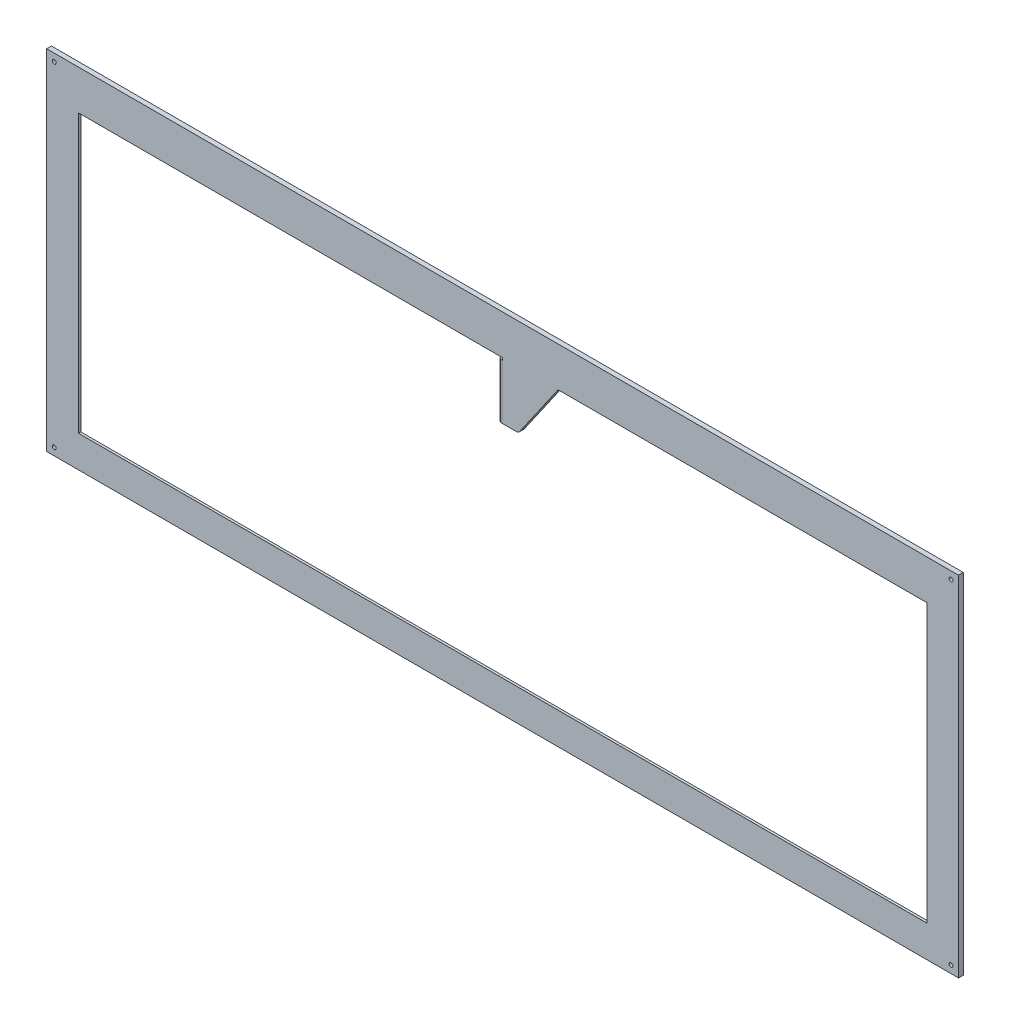
ISO-10303-21;
HEADER;
FILE_DESCRIPTION(('STEP AP214'),'2;1');
FILE_NAME('part.step','',(''),(''),'','','');
FILE_SCHEMA(('AUTOMOTIVE_DESIGN { 1 0 10303 214 1 1 1 1 }'));
ENDSEC;
DATA;
#1=APPLICATION_CONTEXT('core data for automotive mechanical design processes');
#2=APPLICATION_PROTOCOL_DEFINITION('international standard','automotive_design',2000,#1);
#3=PRODUCT_CONTEXT('',#1,'mechanical');
#4=PRODUCT('Part','Part','',(#3));
#5=PRODUCT_RELATED_PRODUCT_CATEGORY('part','',(#4));
#6=PRODUCT_DEFINITION_FORMATION('','',#4);
#7=PRODUCT_DEFINITION_CONTEXT('part definition',#1,'design');
#8=PRODUCT_DEFINITION('design','',#6,#7);
#9=PRODUCT_DEFINITION_SHAPE('','',#8);
#10=(LENGTH_UNIT() NAMED_UNIT(*) SI_UNIT(.MILLI.,.METRE.));
#11=(NAMED_UNIT(*) PLANE_ANGLE_UNIT() SI_UNIT($,.RADIAN.));
#12=(NAMED_UNIT(*) SI_UNIT($,.STERADIAN.) SOLID_ANGLE_UNIT());
#13=UNCERTAINTY_MEASURE_WITH_UNIT(LENGTH_MEASURE(1.E-05),#10,'distance_accuracy_value','');
#14=(GEOMETRIC_REPRESENTATION_CONTEXT(3) GLOBAL_UNCERTAINTY_ASSIGNED_CONTEXT((#13)) GLOBAL_UNIT_ASSIGNED_CONTEXT((#10,
#11,#12)) REPRESENTATION_CONTEXT('',''));
#15=CARTESIAN_POINT('',(0.,0.,0.));
#16=DIRECTION('',(0.,0.,1.));
#17=DIRECTION('',(1.,0.,0.));
#18=AXIS2_PLACEMENT_3D('',#15,#16,#17);
#19=CARTESIAN_POINT('',(-535.,175.,6.));
#20=DIRECTION('',(0.,-1.,0.));
#21=DIRECTION('',(0.,0.,-1.));
#22=AXIS2_PLACEMENT_3D('',#19,#20,#21);
#23=PLANE('',#22);
#24=DIRECTION('',(0.,0.,1.));
#25=VECTOR('',#24,1.);
#26=CARTESIAN_POINT('',(70.,175.,0.));
#27=LINE('',#26,#25);
#28=CARTESIAN_POINT('',(70.,175.,3.));
#29=VERTEX_POINT('',#28);
#30=CARTESIAN_POINT('',(70.,175.,6.));
#31=VERTEX_POINT('',#30);
#32=EDGE_CURVE('E298',#29,#31,#27,.T.);
#33=ORIENTED_EDGE('',*,*,#32,.F.);
#34=DIRECTION('',(1.,0.,0.));
#35=VECTOR('',#34,1.);
#36=CARTESIAN_POINT('',(535.,175.,3.));
#37=LINE('',#36,#35);
#38=CARTESIAN_POINT('',(535.,175.,3.));
#39=VERTEX_POINT('',#38);
#40=EDGE_CURVE('E310',#29,#39,#37,.T.);
#41=ORIENTED_EDGE('',*,*,#40,.T.);
#42=DIRECTION('',(0.,0.,-1.));
#43=VECTOR('',#42,1.);
#44=CARTESIAN_POINT('',(535.,175.,6.));
#45=LINE('',#44,#43);
#46=CARTESIAN_POINT('',(535.,175.,6.));
#47=VERTEX_POINT('',#46);
#48=EDGE_CURVE('E391',#47,#39,#45,.T.);
#49=ORIENTED_EDGE('',*,*,#48,.F.);
#50=DIRECTION('',(-1.,0.,0.));
#51=VECTOR('',#50,1.);
#52=CARTESIAN_POINT('',(-535.,175.,6.));
#53=LINE('',#52,#51);
#54=EDGE_CURVE('E374',#47,#31,#53,.T.);
#55=ORIENTED_EDGE('',*,*,#54,.T.);
#56=EDGE_LOOP('',(#33,#41,#49,#55));
#57=FACE_BOUND('',#56,.T.);
#58=ADVANCED_FACE('F33',(#57),#23,.T.);
#59=CARTESIAN_POINT('',(0.,0.,6.));
#60=DIRECTION('',(0.,0.,-1.));
#61=DIRECTION('',(-1.,0.,0.));
#62=AXIS2_PLACEMENT_3D('',#59,#60,#61);
#63=PLANE('',#62);
#64=CARTESIAN_POINT('',(565.5,-205.5,6.));
#65=DIRECTION('',(0.,0.,-1.));
#66=DIRECTION('',(-1.,0.,0.));
#67=AXIS2_PLACEMENT_3D('',#64,#65,#66);
#68=CIRCLE('',#67,2.49999999999991);
#69=CARTESIAN_POINT('',(563.,-205.5,6.));
#70=VERTEX_POINT('',#69);
#71=EDGE_CURVE('E348',#70,#70,#68,.T.);
#72=ORIENTED_EDGE('',*,*,#71,.T.);
#73=EDGE_LOOP('',(#72));
#74=FACE_BOUND('',#73,.T.);
#75=CARTESIAN_POINT('',(-565.5,-205.5,6.));
#76=DIRECTION('',(0.,0.,-1.));
#77=DIRECTION('',(-1.,0.,0.));
#78=AXIS2_PLACEMENT_3D('',#75,#76,#77);
#79=CIRCLE('',#78,2.49999999999991);
#80=CARTESIAN_POINT('',(-568.,-205.5,6.));
#81=VERTEX_POINT('',#80);
#82=EDGE_CURVE('E354',#81,#81,#79,.T.);
#83=ORIENTED_EDGE('',*,*,#82,.T.);
#84=EDGE_LOOP('',(#83));
#85=FACE_BOUND('',#84,.T.);
#86=CARTESIAN_POINT('',(-565.5,215.5,6.));
#87=DIRECTION('',(0.,0.,-1.));
#88=DIRECTION('',(-1.,0.,0.));
#89=AXIS2_PLACEMENT_3D('',#86,#87,#88);
#90=CIRCLE('',#89,2.49999999999991);
#91=CARTESIAN_POINT('',(-568.,215.5,6.));
#92=VERTEX_POINT('',#91);
#93=EDGE_CURVE('E360',#92,#92,#90,.T.);
#94=ORIENTED_EDGE('',*,*,#93,.T.);
#95=EDGE_LOOP('',(#94));
#96=FACE_BOUND('',#95,.T.);
#97=CARTESIAN_POINT('',(565.5,215.5,6.));
#98=DIRECTION('',(0.,0.,-1.));
#99=DIRECTION('',(-1.,0.,0.));
#100=AXIS2_PLACEMENT_3D('',#97,#98,#99);
#101=CIRCLE('',#100,2.49999999999991);
#102=CARTESIAN_POINT('',(563.,215.5,6.));
#103=VERTEX_POINT('',#102);
#104=EDGE_CURVE('E366',#103,#103,#101,.T.);
#105=ORIENTED_EDGE('',*,*,#104,.T.);
#106=EDGE_LOOP('',(#105));
#107=FACE_BOUND('',#106,.T.);
#108=DIRECTION('',(1.,0.,0.));
#109=VECTOR('',#108,1.);
#110=CARTESIAN_POINT('',(-575.,-215.,6.));
#111=LINE('',#110,#109);
#112=CARTESIAN_POINT('',(-575.,-215.,6.));
#113=VERTEX_POINT('',#112);
#114=CARTESIAN_POINT('',(575.,-215.,6.));
#115=VERTEX_POINT('',#114);
#116=EDGE_CURVE('E395',#113,#115,#111,.T.);
#117=ORIENTED_EDGE('',*,*,#116,.T.);
#118=DIRECTION('',(0.,1.,0.));
#119=VECTOR('',#118,1.);
#120=CARTESIAN_POINT('',(575.,225.,6.));
#121=LINE('',#120,#119);
#122=CARTESIAN_POINT('',(575.,225.,6.));
#123=VERTEX_POINT('',#122);
#124=EDGE_CURVE('E398',#115,#123,#121,.T.);
#125=ORIENTED_EDGE('',*,*,#124,.T.);
#126=DIRECTION('',(-1.,0.,0.));
#127=VECTOR('',#126,1.);
#128=CARTESIAN_POINT('',(-575.,225.,6.));
#129=LINE('',#128,#127);
#130=CARTESIAN_POINT('',(-575.,225.,6.));
#131=VERTEX_POINT('',#130);
#132=EDGE_CURVE('E401',#123,#131,#129,.T.);
#133=ORIENTED_EDGE('',*,*,#132,.T.);
#134=DIRECTION('',(0.,-1.,0.));
#135=VECTOR('',#134,1.);
#136=CARTESIAN_POINT('',(-575.,225.,6.));
#137=LINE('',#136,#135);
#138=EDGE_CURVE('E403',#131,#113,#137,.T.);
#139=ORIENTED_EDGE('',*,*,#138,.T.);
#140=EDGE_LOOP('',(#117,#125,#133,#139));
#141=FACE_BOUND('',#140,.T.);
#142=DIRECTION('',(1.,0.,0.));
#143=VECTOR('',#142,1.);
#144=CARTESIAN_POINT('',(0.,103.,6.));
#145=LINE('',#144,#143);
#146=CARTESIAN_POINT('',(-0.999999999999992,103.,6.));
#147=VERTEX_POINT('',#146);
#148=CARTESIAN_POINT('',(17.3848313886636,103.,6.));
#149=VERTEX_POINT('',#148);
#150=EDGE_CURVE('E290',#147,#149,#145,.T.);
#151=ORIENTED_EDGE('',*,*,#150,.T.);
#152=CARTESIAN_POINT('',(17.3848313886636,108.,6.));
#153=DIRECTION('',(0.,0.,-1.));
#154=DIRECTION('',(-1.,0.,0.));
#155=AXIS2_PLACEMENT_3D('',#152,#153,#154);
#156=CIRCLE('',#155,5.);
#157=CARTESIAN_POINT('',(21.4916812170301,105.148020952523,6.));
#158=VERTEX_POINT('',#157);
#159=EDGE_CURVE('E442',#149,#158,#156,.F.);
#160=ORIENTED_EDGE('',*,*,#159,.T.);
#161=DIRECTION('',(0.570395809495344,0.821369965673296,0.));
#162=VECTOR('',#161,1.);
#163=CARTESIAN_POINT('',(20.,103.,6.));
#164=LINE('',#163,#162);
#165=EDGE_CURVE('E278',#158,#31,#164,.T.);
#166=ORIENTED_EDGE('',*,*,#165,.T.);
#167=ORIENTED_EDGE('',*,*,#54,.F.);
#168=DIRECTION('',(0.,1.,0.));
#169=VECTOR('',#168,1.);
#170=CARTESIAN_POINT('',(535.,175.,6.));
#171=LINE('',#170,#169);
#172=CARTESIAN_POINT('',(535.,-175.,6.));
#173=VERTEX_POINT('',#172);
#174=EDGE_CURVE('E369',#173,#47,#171,.T.);
#175=ORIENTED_EDGE('',*,*,#174,.F.);
#176=DIRECTION('',(1.,0.,0.));
#177=VECTOR('',#176,1.);
#178=CARTESIAN_POINT('',(-535.,-175.,6.));
#179=LINE('',#178,#177);
#180=CARTESIAN_POINT('',(-535.,-175.,6.));
#181=VERTEX_POINT('',#180);
#182=EDGE_CURVE('E380',#181,#173,#179,.T.);
#183=ORIENTED_EDGE('',*,*,#182,.F.);
#184=DIRECTION('',(0.,-1.,0.));
#185=VECTOR('',#184,1.);
#186=CARTESIAN_POINT('',(-535.,175.,6.));
#187=LINE('',#186,#185);
#188=CARTESIAN_POINT('',(-535.,175.,6.));
#189=VERTEX_POINT('',#188);
#190=EDGE_CURVE('E377',#189,#181,#187,.T.);
#191=ORIENTED_EDGE('',*,*,#190,.F.);
#192=CARTESIAN_POINT('',(0.,175.,6.));
#193=VERTEX_POINT('',#192);
#194=EDGE_CURVE('E373',#193,#189,#53,.T.);
#195=ORIENTED_EDGE('',*,*,#194,.F.);
#196=DIRECTION('',(0.,-1.,0.));
#197=VECTOR('',#196,1.);
#198=CARTESIAN_POINT('',(1.11022302462516E-13,175.,6.));
#199=LINE('',#198,#197);
#200=CARTESIAN_POINT('',(1.06763767232988E-13,172.,6.));
#201=VERTEX_POINT('',#200);
#202=EDGE_CURVE('E265',#193,#201,#199,.T.);
#203=ORIENTED_EDGE('',*,*,#202,.T.);
#204=DIRECTION('',(-1.,0.,0.));
#205=VECTOR('',#204,1.);
#206=CARTESIAN_POINT('',(-5.99999999999999,172.,6.));
#207=LINE('',#206,#205);
#208=CARTESIAN_POINT('',(-0.999999999999992,172.,6.));
#209=VERTEX_POINT('',#208);
#210=EDGE_CURVE('E252',#201,#209,#207,.T.);
#211=ORIENTED_EDGE('',*,*,#210,.T.);
#212=DIRECTION('',(0.,-1.,0.));
#213=VECTOR('',#212,1.);
#214=CARTESIAN_POINT('',(-0.999999999999992,103.,6.));
#215=LINE('',#214,#213);
#216=EDGE_CURVE('E439',#209,#147,#215,.T.);
#217=ORIENTED_EDGE('',*,*,#216,.T.);
#218=EDGE_LOOP('',(#151,#160,#166,#167,#175,#183,#191,#195,#203,#211,#217));
#219=FACE_BOUND('',#218,.T.);
#220=ADVANCED_FACE('F490',(#74,#85,#96,#107,#141,#219),#63,.F.);
#221=CARTESIAN_POINT('',(0.,0.,0.));
#222=DIRECTION('',(0.,0.,-1.));
#223=DIRECTION('',(-1.,0.,0.));
#224=AXIS2_PLACEMENT_3D('',#221,#222,#223);
#225=PLANE('',#224);
#226=DIRECTION('',(-1.,0.,0.));
#227=VECTOR('',#226,1.);
#228=CARTESIAN_POINT('',(-556.,-196.,0.));
#229=LINE('',#228,#227);
#230=CARTESIAN_POINT('',(556.,-196.,0.));
#231=VERTEX_POINT('',#230);
#232=CARTESIAN_POINT('',(-556.,-196.,0.));
#233=VERTEX_POINT('',#232);
#234=EDGE_CURVE('E314',#231,#233,#229,.T.);
#235=ORIENTED_EDGE('',*,*,#234,.F.);
#236=DIRECTION('',(0.,-1.,0.));
#237=VECTOR('',#236,1.);
#238=CARTESIAN_POINT('',(556.,-196.,0.));
#239=LINE('',#238,#237);
#240=CARTESIAN_POINT('',(556.,206.,0.));
#241=VERTEX_POINT('',#240);
#242=EDGE_CURVE('E320',#241,#231,#239,.T.);
#243=ORIENTED_EDGE('',*,*,#242,.F.);
#244=DIRECTION('',(1.,0.,0.));
#245=VECTOR('',#244,1.);
#246=CARTESIAN_POINT('',(556.,206.,0.));
#247=LINE('',#246,#245);
#248=CARTESIAN_POINT('',(-556.,206.,0.));
#249=VERTEX_POINT('',#248);
#250=EDGE_CURVE('E334',#249,#241,#247,.T.);
#251=ORIENTED_EDGE('',*,*,#250,.F.);
#252=DIRECTION('',(0.,1.,0.));
#253=VECTOR('',#252,1.);
#254=CARTESIAN_POINT('',(-556.,206.,0.));
#255=LINE('',#254,#253);
#256=EDGE_CURVE('E331',#233,#249,#255,.T.);
#257=ORIENTED_EDGE('',*,*,#256,.F.);
#258=EDGE_LOOP('',(#235,#243,#251,#257));
#259=FACE_BOUND('',#258,.T.);
#260=CARTESIAN_POINT('',(565.5,-205.5,0.));
#261=DIRECTION('',(0.,0.,-1.));
#262=DIRECTION('',(-1.,0.,0.));
#263=AXIS2_PLACEMENT_3D('',#260,#261,#262);
#264=CIRCLE('',#263,2.49999999999991);
#265=CARTESIAN_POINT('',(563.,-205.5,0.));
#266=VERTEX_POINT('',#265);
#267=EDGE_CURVE('E341',#266,#266,#264,.T.);
#268=ORIENTED_EDGE('',*,*,#267,.F.);
#269=EDGE_LOOP('',(#268));
#270=FACE_BOUND('',#269,.T.);
#271=CARTESIAN_POINT('',(-565.5,-205.5,0.));
#272=DIRECTION('',(0.,0.,-1.));
#273=DIRECTION('',(-1.,0.,0.));
#274=AXIS2_PLACEMENT_3D('',#271,#272,#273);
#275=CIRCLE('',#274,2.49999999999991);
#276=CARTESIAN_POINT('',(-568.,-205.5,0.));
#277=VERTEX_POINT('',#276);
#278=EDGE_CURVE('E351',#277,#277,#275,.T.);
#279=ORIENTED_EDGE('',*,*,#278,.F.);
#280=EDGE_LOOP('',(#279));
#281=FACE_BOUND('',#280,.T.);
#282=CARTESIAN_POINT('',(-565.5,215.5,0.));
#283=DIRECTION('',(0.,0.,-1.));
#284=DIRECTION('',(-1.,0.,0.));
#285=AXIS2_PLACEMENT_3D('',#282,#283,#284);
#286=CIRCLE('',#285,2.49999999999991);
#287=CARTESIAN_POINT('',(-568.,215.5,0.));
#288=VERTEX_POINT('',#287);
#289=EDGE_CURVE('E357',#288,#288,#286,.T.);
#290=ORIENTED_EDGE('',*,*,#289,.F.);
#291=EDGE_LOOP('',(#290));
#292=FACE_BOUND('',#291,.T.);
#293=CARTESIAN_POINT('',(565.5,215.5,0.));
#294=DIRECTION('',(0.,0.,-1.));
#295=DIRECTION('',(-1.,0.,0.));
#296=AXIS2_PLACEMENT_3D('',#293,#294,#295);
#297=CIRCLE('',#296,2.49999999999991);
#298=CARTESIAN_POINT('',(563.,215.5,0.));
#299=VERTEX_POINT('',#298);
#300=EDGE_CURVE('E363',#299,#299,#297,.T.);
#301=ORIENTED_EDGE('',*,*,#300,.F.);
#302=EDGE_LOOP('',(#301));
#303=FACE_BOUND('',#302,.T.);
#304=DIRECTION('',(1.,0.,0.));
#305=VECTOR('',#304,1.);
#306=CARTESIAN_POINT('',(-575.,-215.,0.));
#307=LINE('',#306,#305);
#308=CARTESIAN_POINT('',(-575.,-215.,0.));
#309=VERTEX_POINT('',#308);
#310=CARTESIAN_POINT('',(575.,-215.,0.));
#311=VERTEX_POINT('',#310);
#312=EDGE_CURVE('E394',#309,#311,#307,.T.);
#313=ORIENTED_EDGE('',*,*,#312,.F.);
#314=DIRECTION('',(0.,-1.,0.));
#315=VECTOR('',#314,1.);
#316=CARTESIAN_POINT('',(-575.,225.,0.));
#317=LINE('',#316,#315);
#318=CARTESIAN_POINT('',(-575.,225.,0.));
#319=VERTEX_POINT('',#318);
#320=EDGE_CURVE('E399',#319,#309,#317,.T.);
#321=ORIENTED_EDGE('',*,*,#320,.F.);
#322=DIRECTION('',(-1.,0.,0.));
#323=VECTOR('',#322,1.);
#324=CARTESIAN_POINT('',(-575.,225.,0.));
#325=LINE('',#324,#323);
#326=CARTESIAN_POINT('',(575.,225.,0.));
#327=VERTEX_POINT('',#326);
#328=EDGE_CURVE('E410',#327,#319,#325,.T.);
#329=ORIENTED_EDGE('',*,*,#328,.F.);
#330=DIRECTION('',(0.,1.,0.));
#331=VECTOR('',#330,1.);
#332=CARTESIAN_POINT('',(575.,225.,0.));
#333=LINE('',#332,#331);
#334=EDGE_CURVE('E408',#311,#327,#333,.T.);
#335=ORIENTED_EDGE('',*,*,#334,.F.);
#336=EDGE_LOOP('',(#313,#321,#329,#335));
#337=FACE_BOUND('',#336,.T.);
#338=ADVANCED_FACE('F555',(#259,#270,#281,#292,#303,#337),#225,.T.);
#339=CARTESIAN_POINT('',(-575.,-215.,6.));
#340=DIRECTION('',(0.,1.,0.));
#341=DIRECTION('',(-1.,0.,0.));
#342=AXIS2_PLACEMENT_3D('',#339,#340,#341);
#343=PLANE('',#342);
#344=ORIENTED_EDGE('',*,*,#312,.T.);
#345=DIRECTION('',(0.,0.,-1.));
#346=VECTOR('',#345,1.);
#347=CARTESIAN_POINT('',(575.,-215.,6.));
#348=LINE('',#347,#346);
#349=EDGE_CURVE('E421',#115,#311,#348,.T.);
#350=ORIENTED_EDGE('',*,*,#349,.F.);
#351=ORIENTED_EDGE('',*,*,#116,.F.);
#352=DIRECTION('',(0.,0.,-1.));
#353=VECTOR('',#352,1.);
#354=CARTESIAN_POINT('',(-575.,-215.,6.));
#355=LINE('',#354,#353);
#356=EDGE_CURVE('E405',#113,#309,#355,.T.);
#357=ORIENTED_EDGE('',*,*,#356,.T.);
#358=EDGE_LOOP('',(#344,#350,#351,#357));
#359=FACE_BOUND('',#358,.T.);
#360=ADVANCED_FACE('F558',(#359),#343,.F.);
#361=CARTESIAN_POINT('',(575.,225.,6.));
#362=DIRECTION('',(-1.,0.,0.));
#363=DIRECTION('',(0.,0.,1.));
#364=AXIS2_PLACEMENT_3D('',#361,#362,#363);
#365=PLANE('',#364);
#366=ORIENTED_EDGE('',*,*,#334,.T.);
#367=DIRECTION('',(0.,0.,-1.));
#368=VECTOR('',#367,1.);
#369=CARTESIAN_POINT('',(575.,225.,6.));
#370=LINE('',#369,#368);
#371=EDGE_CURVE('E418',#123,#327,#370,.T.);
#372=ORIENTED_EDGE('',*,*,#371,.F.);
#373=ORIENTED_EDGE('',*,*,#124,.F.);
#374=ORIENTED_EDGE('',*,*,#349,.T.);
#375=EDGE_LOOP('',(#366,#372,#373,#374));
#376=FACE_BOUND('',#375,.T.);
#377=ADVANCED_FACE('F584',(#376),#365,.F.);
#378=CARTESIAN_POINT('',(-575.,225.,6.));
#379=DIRECTION('',(0.,-1.,0.));
#380=DIRECTION('',(0.,0.,-1.));
#381=AXIS2_PLACEMENT_3D('',#378,#379,#380);
#382=PLANE('',#381);
#383=ORIENTED_EDGE('',*,*,#328,.T.);
#384=DIRECTION('',(0.,0.,-1.));
#385=VECTOR('',#384,1.);
#386=CARTESIAN_POINT('',(-575.,225.,6.));
#387=LINE('',#386,#385);
#388=EDGE_CURVE('E415',#131,#319,#387,.T.);
#389=ORIENTED_EDGE('',*,*,#388,.F.);
#390=ORIENTED_EDGE('',*,*,#132,.F.);
#391=ORIENTED_EDGE('',*,*,#371,.T.);
#392=EDGE_LOOP('',(#383,#389,#390,#391));
#393=FACE_BOUND('',#392,.T.);
#394=ADVANCED_FACE('F581',(#393),#382,.F.);
#395=CARTESIAN_POINT('',(-575.,225.,6.));
#396=DIRECTION('',(1.,0.,0.));
#397=DIRECTION('',(0.,0.,-1.));
#398=AXIS2_PLACEMENT_3D('',#395,#396,#397);
#399=PLANE('',#398);
#400=ORIENTED_EDGE('',*,*,#320,.T.);
#401=ORIENTED_EDGE('',*,*,#356,.F.);
#402=ORIENTED_EDGE('',*,*,#138,.F.);
#403=ORIENTED_EDGE('',*,*,#388,.T.);
#404=EDGE_LOOP('',(#400,#401,#402,#403));
#405=FACE_BOUND('',#404,.T.);
#406=ADVANCED_FACE('F577',(#405),#399,.F.);
#407=CARTESIAN_POINT('',(535.,175.,6.));
#408=DIRECTION('',(-1.,0.,0.));
#409=DIRECTION('',(0.,0.,1.));
#410=AXIS2_PLACEMENT_3D('',#407,#408,#409);
#411=PLANE('',#410);
#412=DIRECTION('',(0.,-1.,0.));
#413=VECTOR('',#412,1.);
#414=CARTESIAN_POINT('',(535.,-175.,3.));
#415=LINE('',#414,#413);
#416=CARTESIAN_POINT('',(535.,-175.,3.));
#417=VERTEX_POINT('',#416);
#418=EDGE_CURVE('E297',#39,#417,#415,.T.);
#419=ORIENTED_EDGE('',*,*,#418,.T.);
#420=DIRECTION('',(0.,0.,-1.));
#421=VECTOR('',#420,1.);
#422=CARTESIAN_POINT('',(535.,-175.,6.));
#423=LINE('',#422,#421);
#424=EDGE_CURVE('E382',#173,#417,#423,.T.);
#425=ORIENTED_EDGE('',*,*,#424,.F.);
#426=ORIENTED_EDGE('',*,*,#174,.T.);
#427=ORIENTED_EDGE('',*,*,#48,.T.);
#428=EDGE_LOOP('',(#419,#425,#426,#427));
#429=FACE_BOUND('',#428,.T.);
#430=ADVANCED_FACE('F523',(#429),#411,.T.);
#431=DIRECTION('',(0.,0.,1.));
#432=VECTOR('',#431,1.);
#433=CARTESIAN_POINT('',(1.11022302462516E-13,175.,0.));
#434=LINE('',#433,#432);
#435=CARTESIAN_POINT('',(1.11022302462516E-13,175.,3.));
#436=VERTEX_POINT('',#435);
#437=EDGE_CURVE('E287',#436,#193,#434,.T.);
#438=ORIENTED_EDGE('',*,*,#437,.T.);
#439=ORIENTED_EDGE('',*,*,#194,.T.);
#440=DIRECTION('',(0.,0.,-1.));
#441=VECTOR('',#440,1.);
#442=CARTESIAN_POINT('',(-535.,175.,6.));
#443=LINE('',#442,#441);
#444=CARTESIAN_POINT('',(-535.,175.,3.));
#445=VERTEX_POINT('',#444);
#446=EDGE_CURVE('E388',#189,#445,#443,.T.);
#447=ORIENTED_EDGE('',*,*,#446,.T.);
#448=EDGE_CURVE('E311',#445,#436,#37,.T.);
#449=ORIENTED_EDGE('',*,*,#448,.T.);
#450=EDGE_LOOP('',(#438,#439,#447,#449));
#451=FACE_BOUND('',#450,.T.);
#452=ADVANCED_FACE('F532',(#451),#23,.T.);
#453=CARTESIAN_POINT('',(-535.,175.,6.));
#454=DIRECTION('',(1.,0.,0.));
#455=DIRECTION('',(0.,0.,-1.));
#456=AXIS2_PLACEMENT_3D('',#453,#454,#455);
#457=PLANE('',#456);
#458=DIRECTION('',(0.,1.,0.));
#459=VECTOR('',#458,1.);
#460=CARTESIAN_POINT('',(-535.,175.,3.));
#461=LINE('',#460,#459);
#462=CARTESIAN_POINT('',(-535.,-175.,3.));
#463=VERTEX_POINT('',#462);
#464=EDGE_CURVE('E307',#463,#445,#461,.T.);
#465=ORIENTED_EDGE('',*,*,#464,.T.);
#466=ORIENTED_EDGE('',*,*,#446,.F.);
#467=ORIENTED_EDGE('',*,*,#190,.T.);
#468=DIRECTION('',(0.,0.,-1.));
#469=VECTOR('',#468,1.);
#470=CARTESIAN_POINT('',(-535.,-175.,6.));
#471=LINE('',#470,#469);
#472=EDGE_CURVE('E385',#181,#463,#471,.T.);
#473=ORIENTED_EDGE('',*,*,#472,.T.);
#474=EDGE_LOOP('',(#465,#466,#467,#473));
#475=FACE_BOUND('',#474,.T.);
#476=ADVANCED_FACE('F530',(#475),#457,.T.);
#477=CARTESIAN_POINT('',(-535.,-175.,6.));
#478=DIRECTION('',(0.,1.,0.));
#479=DIRECTION('',(0.,0.,1.));
#480=AXIS2_PLACEMENT_3D('',#477,#478,#479);
#481=PLANE('',#480);
#482=DIRECTION('',(-1.,0.,0.));
#483=VECTOR('',#482,1.);
#484=CARTESIAN_POINT('',(-535.,-175.,3.));
#485=LINE('',#484,#483);
#486=EDGE_CURVE('E304',#417,#463,#485,.T.);
#487=ORIENTED_EDGE('',*,*,#486,.T.);
#488=ORIENTED_EDGE('',*,*,#472,.F.);
#489=ORIENTED_EDGE('',*,*,#182,.T.);
#490=ORIENTED_EDGE('',*,*,#424,.T.);
#491=EDGE_LOOP('',(#487,#488,#489,#490));
#492=FACE_BOUND('',#491,.T.);
#493=ADVANCED_FACE('F527',(#492),#481,.T.);
#494=CARTESIAN_POINT('',(565.5,215.5,6.));
#495=DIRECTION('',(0.,0.,-1.));
#496=DIRECTION('',(-1.,0.,0.));
#497=AXIS2_PLACEMENT_3D('',#494,#495,#496);
#498=CYLINDRICAL_SURFACE('',#497,2.49999999999991);
#499=ORIENTED_EDGE('',*,*,#104,.F.);
#500=EDGE_LOOP('',(#499));
#501=FACE_BOUND('',#500,.T.);
#502=ORIENTED_EDGE('',*,*,#300,.T.);
#503=EDGE_LOOP('',(#502));
#504=FACE_BOUND('',#503,.T.);
#505=ADVANCED_FACE('F811',(#501,#504),#498,.F.);
#506=CARTESIAN_POINT('',(-565.5,215.5,6.));
#507=DIRECTION('',(0.,0.,-1.));
#508=DIRECTION('',(-1.,0.,0.));
#509=AXIS2_PLACEMENT_3D('',#506,#507,#508);
#510=CYLINDRICAL_SURFACE('',#509,2.49999999999991);
#511=ORIENTED_EDGE('',*,*,#93,.F.);
#512=EDGE_LOOP('',(#511));
#513=FACE_BOUND('',#512,.T.);
#514=ORIENTED_EDGE('',*,*,#289,.T.);
#515=EDGE_LOOP('',(#514));
#516=FACE_BOUND('',#515,.T.);
#517=ADVANCED_FACE('F850',(#513,#516),#510,.F.);
#518=CARTESIAN_POINT('',(-565.5,-205.5,6.));
#519=DIRECTION('',(0.,0.,-1.));
#520=DIRECTION('',(-1.,0.,0.));
#521=AXIS2_PLACEMENT_3D('',#518,#519,#520);
#522=CYLINDRICAL_SURFACE('',#521,2.49999999999991);
#523=ORIENTED_EDGE('',*,*,#82,.F.);
#524=EDGE_LOOP('',(#523));
#525=FACE_BOUND('',#524,.T.);
#526=ORIENTED_EDGE('',*,*,#278,.T.);
#527=EDGE_LOOP('',(#526));
#528=FACE_BOUND('',#527,.T.);
#529=ADVANCED_FACE('F840',(#525,#528),#522,.F.);
#530=CARTESIAN_POINT('',(565.5,-205.5,6.));
#531=DIRECTION('',(0.,0.,-1.));
#532=DIRECTION('',(-1.,0.,0.));
#533=AXIS2_PLACEMENT_3D('',#530,#531,#532);
#534=CYLINDRICAL_SURFACE('',#533,2.49999999999991);
#535=ORIENTED_EDGE('',*,*,#71,.F.);
#536=EDGE_LOOP('',(#535));
#537=FACE_BOUND('',#536,.T.);
#538=ORIENTED_EDGE('',*,*,#267,.T.);
#539=EDGE_LOOP('',(#538));
#540=FACE_BOUND('',#539,.T.);
#541=ADVANCED_FACE('F800',(#537,#540),#534,.F.);
#542=CARTESIAN_POINT('',(-556.,-196.,3.));
#543=DIRECTION('',(0.,-1.,0.));
#544=DIRECTION('',(0.,0.,-1.));
#545=AXIS2_PLACEMENT_3D('',#542,#543,#544);
#546=PLANE('',#545);
#547=ORIENTED_EDGE('',*,*,#234,.T.);
#548=DIRECTION('',(0.,0.,-1.));
#549=VECTOR('',#548,1.);
#550=CARTESIAN_POINT('',(-556.,-196.,3.));
#551=LINE('',#550,#549);
#552=CARTESIAN_POINT('',(-556.,-196.,3.));
#553=VERTEX_POINT('',#552);
#554=EDGE_CURVE('E329',#553,#233,#551,.T.);
#555=ORIENTED_EDGE('',*,*,#554,.F.);
#556=DIRECTION('',(-1.,0.,0.));
#557=VECTOR('',#556,1.);
#558=CARTESIAN_POINT('',(-556.,-196.,3.));
#559=LINE('',#558,#557);
#560=CARTESIAN_POINT('',(556.,-196.,3.));
#561=VERTEX_POINT('',#560);
#562=EDGE_CURVE('E316',#561,#553,#559,.T.);
#563=ORIENTED_EDGE('',*,*,#562,.F.);
#564=DIRECTION('',(0.,0.,-1.));
#565=VECTOR('',#564,1.);
#566=CARTESIAN_POINT('',(556.,-196.,3.));
#567=LINE('',#566,#565);
#568=EDGE_CURVE('E339',#561,#231,#567,.T.);
#569=ORIENTED_EDGE('',*,*,#568,.T.);
#570=EDGE_LOOP('',(#547,#555,#563,#569));
#571=FACE_BOUND('',#570,.T.);
#572=ADVANCED_FACE('F543',(#571),#546,.F.);
#573=CARTESIAN_POINT('',(556.,-196.,3.));
#574=DIRECTION('',(1.,0.,0.));
#575=DIRECTION('',(0.,0.,-1.));
#576=AXIS2_PLACEMENT_3D('',#573,#574,#575);
#577=PLANE('',#576);
#578=ORIENTED_EDGE('',*,*,#242,.T.);
#579=ORIENTED_EDGE('',*,*,#568,.F.);
#580=DIRECTION('',(0.,-1.,0.));
#581=VECTOR('',#580,1.);
#582=CARTESIAN_POINT('',(556.,-196.,3.));
#583=LINE('',#582,#581);
#584=CARTESIAN_POINT('',(556.,206.,3.));
#585=VERTEX_POINT('',#584);
#586=EDGE_CURVE('E326',#585,#561,#583,.T.);
#587=ORIENTED_EDGE('',*,*,#586,.F.);
#588=DIRECTION('',(0.,0.,-1.));
#589=VECTOR('',#588,1.);
#590=CARTESIAN_POINT('',(556.,206.,3.));
#591=LINE('',#590,#589);
#592=EDGE_CURVE('E342',#585,#241,#591,.T.);
#593=ORIENTED_EDGE('',*,*,#592,.T.);
#594=EDGE_LOOP('',(#578,#579,#587,#593));
#595=FACE_BOUND('',#594,.T.);
#596=ADVANCED_FACE('F552',(#595),#577,.F.);
#597=CARTESIAN_POINT('',(556.,206.,3.));
#598=DIRECTION('',(0.,1.,0.));
#599=DIRECTION('',(0.,0.,1.));
#600=AXIS2_PLACEMENT_3D('',#597,#598,#599);
#601=PLANE('',#600);
#602=ORIENTED_EDGE('',*,*,#250,.T.);
#603=ORIENTED_EDGE('',*,*,#592,.F.);
#604=DIRECTION('',(1.,0.,0.));
#605=VECTOR('',#604,1.);
#606=CARTESIAN_POINT('',(556.,206.,3.));
#607=LINE('',#606,#605);
#608=CARTESIAN_POINT('',(-556.,206.,3.));
#609=VERTEX_POINT('',#608);
#610=EDGE_CURVE('E323',#609,#585,#607,.T.);
#611=ORIENTED_EDGE('',*,*,#610,.F.);
#612=DIRECTION('',(0.,0.,-1.));
#613=VECTOR('',#612,1.);
#614=CARTESIAN_POINT('',(-556.,206.,3.));
#615=LINE('',#614,#613);
#616=EDGE_CURVE('E344',#609,#249,#615,.T.);
#617=ORIENTED_EDGE('',*,*,#616,.T.);
#618=EDGE_LOOP('',(#602,#603,#611,#617));
#619=FACE_BOUND('',#618,.T.);
#620=ADVANCED_FACE('F550',(#619),#601,.F.);
#621=CARTESIAN_POINT('',(-556.,206.,3.));
#622=DIRECTION('',(-1.,0.,0.));
#623=DIRECTION('',(0.,-1.,0.));
#624=AXIS2_PLACEMENT_3D('',#621,#622,#623);
#625=PLANE('',#624);
#626=ORIENTED_EDGE('',*,*,#256,.T.);
#627=ORIENTED_EDGE('',*,*,#616,.F.);
#628=DIRECTION('',(0.,1.,0.));
#629=VECTOR('',#628,1.);
#630=CARTESIAN_POINT('',(-556.,206.,3.));
#631=LINE('',#630,#629);
#632=EDGE_CURVE('E319',#553,#609,#631,.T.);
#633=ORIENTED_EDGE('',*,*,#632,.F.);
#634=ORIENTED_EDGE('',*,*,#554,.T.);
#635=EDGE_LOOP('',(#626,#627,#633,#634));
#636=FACE_BOUND('',#635,.T.);
#637=ADVANCED_FACE('F537',(#636),#625,.F.);
#638=CARTESIAN_POINT('',(0.,0.,3.));
#639=DIRECTION('',(0.,0.,1.));
#640=DIRECTION('',(1.,0.,0.));
#641=AXIS2_PLACEMENT_3D('',#638,#639,#640);
#642=PLANE('',#641);
#643=ORIENTED_EDGE('',*,*,#418,.F.);
#644=ORIENTED_EDGE('',*,*,#40,.F.);
#645=EDGE_CURVE('E315',#436,#29,#37,.T.);
#646=ORIENTED_EDGE('',*,*,#645,.F.);
#647=ORIENTED_EDGE('',*,*,#448,.F.);
#648=ORIENTED_EDGE('',*,*,#464,.F.);
#649=ORIENTED_EDGE('',*,*,#486,.F.);
#650=EDGE_LOOP('',(#643,#644,#646,#647,#648,#649));
#651=FACE_BOUND('',#650,.T.);
#652=ORIENTED_EDGE('',*,*,#562,.T.);
#653=ORIENTED_EDGE('',*,*,#632,.T.);
#654=ORIENTED_EDGE('',*,*,#610,.T.);
#655=ORIENTED_EDGE('',*,*,#586,.T.);
#656=EDGE_LOOP('',(#652,#653,#654,#655));
#657=FACE_BOUND('',#656,.T.);
#658=ADVANCED_FACE('F534',(#651,#657),#642,.F.);
#659=CARTESIAN_POINT('',(70.,175.,0.));
#660=DIRECTION('',(0.,1.,0.));
#661=DIRECTION('',(-1.,0.,0.));
#662=AXIS2_PLACEMENT_3D('',#659,#660,#661);
#663=PLANE('',#662);
#664=ORIENTED_EDGE('',*,*,#645,.T.);
#665=CARTESIAN_POINT('',(70.,175.,0.));
#666=VERTEX_POINT('',#665);
#667=EDGE_CURVE('E294',#666,#29,#27,.T.);
#668=ORIENTED_EDGE('',*,*,#667,.F.);
#669=DIRECTION('',(-1.,0.,0.));
#670=VECTOR('',#669,1.);
#671=CARTESIAN_POINT('',(70.,175.,0.));
#672=LINE('',#671,#670);
#673=CARTESIAN_POINT('',(1.11022302462516E-13,175.,0.));
#674=VERTEX_POINT('',#673);
#675=EDGE_CURVE('E274',#666,#674,#672,.T.);
#676=ORIENTED_EDGE('',*,*,#675,.T.);
#677=EDGE_CURVE('E299',#674,#436,#434,.T.);
#678=ORIENTED_EDGE('',*,*,#677,.T.);
#679=EDGE_LOOP('',(#664,#668,#676,#678));
#680=FACE_BOUND('',#679,.T.);
#681=ADVANCED_FACE('F506',(#680),#663,.T.);
#682=CARTESIAN_POINT('',(20.,103.,0.));
#683=DIRECTION('',(0.821369965673296,-0.570395809495344,0.));
#684=DIRECTION('',(0.570395809495344,0.821369965673296,0.));
#685=AXIS2_PLACEMENT_3D('',#682,#683,#684);
#686=PLANE('',#685);
#687=ORIENTED_EDGE('',*,*,#165,.F.);
#688=DIRECTION('',(0.,0.,1.));
#689=VECTOR('',#688,1.);
#690=CARTESIAN_POINT('',(21.4916812170301,105.148020952523,0.));
#691=LINE('',#690,#689);
#692=CARTESIAN_POINT('',(21.4916812170301,105.148020952523,0.));
#693=VERTEX_POINT('',#692);
#694=EDGE_CURVE('E444',#158,#693,#691,.F.);
#695=ORIENTED_EDGE('',*,*,#694,.T.);
#696=DIRECTION('',(0.570395809495344,0.821369965673296,0.));
#697=VECTOR('',#696,1.);
#698=CARTESIAN_POINT('',(20.,103.,0.));
#699=LINE('',#698,#697);
#700=EDGE_CURVE('E285',#693,#666,#699,.T.);
#701=ORIENTED_EDGE('',*,*,#700,.T.);
#702=ORIENTED_EDGE('',*,*,#667,.T.);
#703=ORIENTED_EDGE('',*,*,#32,.T.);
#704=EDGE_LOOP('',(#687,#695,#701,#702,#703));
#705=FACE_BOUND('',#704,.T.);
#706=ADVANCED_FACE('F510',(#705),#686,.T.);
#707=CARTESIAN_POINT('',(0.,103.,0.));
#708=DIRECTION('',(0.,-1.,0.));
#709=DIRECTION('',(0.,0.,-1.));
#710=AXIS2_PLACEMENT_3D('',#707,#708,#709);
#711=PLANE('',#710);
#712=DIRECTION('',(1.,0.,0.));
#713=VECTOR('',#712,1.);
#714=CARTESIAN_POINT('',(0.,103.,0.));
#715=LINE('',#714,#713);
#716=CARTESIAN_POINT('',(0.,103.,0.));
#717=VERTEX_POINT('',#716);
#718=CARTESIAN_POINT('',(17.3848313886636,103.,0.));
#719=VERTEX_POINT('',#718);
#720=EDGE_CURVE('E282',#717,#719,#715,.T.);
#721=ORIENTED_EDGE('',*,*,#720,.T.);
#722=DIRECTION('',(0.,0.,1.));
#723=VECTOR('',#722,1.);
#724=CARTESIAN_POINT('',(17.3848313886636,103.,0.));
#725=LINE('',#724,#723);
#726=EDGE_CURVE('E436',#719,#149,#725,.T.);
#727=ORIENTED_EDGE('',*,*,#726,.T.);
#728=ORIENTED_EDGE('',*,*,#150,.F.);
#729=CARTESIAN_POINT('',(-0.999999999999992,103.,1.));
#730=DIRECTION('',(0.,-1.,0.));
#731=DIRECTION('',(0.,0.,-1.));
#732=AXIS2_PLACEMENT_3D('',#729,#730,#731);
#733=CIRCLE('',#732,5.);
#734=CARTESIAN_POINT('',(-5.99999999999999,103.,0.999999999999994));
#735=VERTEX_POINT('',#734);
#736=EDGE_CURVE('E434',#147,#735,#733,.T.);
#737=ORIENTED_EDGE('',*,*,#736,.T.);
#738=DIRECTION('',(0.,0.,1.));
#739=VECTOR('',#738,1.);
#740=CARTESIAN_POINT('',(-5.99999999999999,103.,-20.));
#741=LINE('',#740,#739);
#742=CARTESIAN_POINT('',(-5.99999999999999,103.,-15.));
#743=VERTEX_POINT('',#742);
#744=EDGE_CURVE('E266',#743,#735,#741,.T.);
#745=ORIENTED_EDGE('',*,*,#744,.F.);
#746=DIRECTION('',(1.,0.,0.));
#747=VECTOR('',#746,1.);
#748=CARTESIAN_POINT('',(0.,103.,-15.));
#749=LINE('',#748,#747);
#750=CARTESIAN_POINT('',(0.,103.,-15.));
#751=VERTEX_POINT('',#750);
#752=EDGE_CURVE('E431',#743,#751,#749,.T.);
#753=ORIENTED_EDGE('',*,*,#752,.T.);
#754=DIRECTION('',(0.,0.,1.));
#755=VECTOR('',#754,1.);
#756=CARTESIAN_POINT('',(0.,103.,-20.));
#757=LINE('',#756,#755);
#758=EDGE_CURVE('E263',#751,#717,#757,.T.);
#759=ORIENTED_EDGE('',*,*,#758,.T.);
#760=EDGE_LOOP('',(#721,#727,#728,#737,#745,#753,#759));
#761=FACE_BOUND('',#760,.T.);
#762=ADVANCED_FACE('F483',(#761),#711,.T.);
#763=CARTESIAN_POINT('',(1.11022302462516E-13,175.,0.));
#764=DIRECTION('',(-1.,0.,0.));
#765=DIRECTION('',(0.,-1.,0.));
#766=AXIS2_PLACEMENT_3D('',#763,#764,#765);
#767=PLANE('',#766);
#768=DIRECTION('',(0.,0.,1.));
#769=VECTOR('',#768,1.);
#770=CARTESIAN_POINT('',(0.,172.,-20.));
#771=LINE('',#770,#769);
#772=CARTESIAN_POINT('',(1.06763767232988E-13,172.,0.));
#773=VERTEX_POINT('',#772);
#774=EDGE_CURVE('E260',#773,#201,#771,.T.);
#775=ORIENTED_EDGE('',*,*,#774,.T.);
#776=ORIENTED_EDGE('',*,*,#202,.F.);
#777=ORIENTED_EDGE('',*,*,#437,.F.);
#778=ORIENTED_EDGE('',*,*,#677,.F.);
#779=DIRECTION('',(0.,-1.,0.));
#780=VECTOR('',#779,1.);
#781=CARTESIAN_POINT('',(1.11022302462516E-13,175.,0.));
#782=LINE('',#781,#780);
#783=EDGE_CURVE('E279',#674,#773,#782,.T.);
#784=ORIENTED_EDGE('',*,*,#783,.T.);
#785=EDGE_LOOP('',(#775,#776,#777,#778,#784));
#786=FACE_BOUND('',#785,.T.);
#787=ADVANCED_FACE('F496',(#786),#767,.T.);
#788=CARTESIAN_POINT('',(0.,0.,0.));
#789=DIRECTION('',(0.,0.,1.));
#790=DIRECTION('',(1.,0.,0.));
#791=AXIS2_PLACEMENT_3D('',#788,#789,#790);
#792=PLANE('',#791);
#793=ORIENTED_EDGE('',*,*,#700,.F.);
#794=CARTESIAN_POINT('',(17.3848313886636,108.,0.));
#795=DIRECTION('',(0.,0.,1.));
#796=DIRECTION('',(1.,0.,0.));
#797=AXIS2_PLACEMENT_3D('',#794,#795,#796);
#798=CIRCLE('',#797,5.);
#799=EDGE_CURVE('E446',#693,#719,#798,.F.);
#800=ORIENTED_EDGE('',*,*,#799,.T.);
#801=ORIENTED_EDGE('',*,*,#720,.F.);
#802=EDGE_CURVE('E277',#773,#717,#782,.T.);
#803=ORIENTED_EDGE('',*,*,#802,.F.);
#804=ORIENTED_EDGE('',*,*,#783,.F.);
#805=ORIENTED_EDGE('',*,*,#675,.F.);
#806=EDGE_LOOP('',(#793,#800,#801,#803,#804,#805));
#807=FACE_BOUND('',#806,.T.);
#808=ADVANCED_FACE('F501',(#807),#792,.F.);
#809=CARTESIAN_POINT('',(0.,172.,-20.));
#810=DIRECTION('',(1.,0.,0.));
#811=DIRECTION('',(0.,1.,0.));
#812=AXIS2_PLACEMENT_3D('',#809,#810,#811);
#813=PLANE('',#812);
#814=CARTESIAN_POINT('',(0.,162.,-10.));
#815=DIRECTION('',(1.,0.,0.));
#816=DIRECTION('',(0.,1.,0.));
#817=AXIS2_PLACEMENT_3D('',#814,#815,#816);
#818=CIRCLE('',#817,3.);
#819=CARTESIAN_POINT('',(0.,162.,-13.));
#820=VERTEX_POINT('',#819);
#821=CARTESIAN_POINT('',(0.,162.,-7.));
#822=VERTEX_POINT('',#821);
#823=EDGE_CURVE('E241',#820,#822,#818,.T.);
#824=ORIENTED_EDGE('',*,*,#823,.F.);
#825=DIRECTION('',(0.,1.,0.));
#826=VECTOR('',#825,1.);
#827=CARTESIAN_POINT('',(0.,162.,-13.));
#828=LINE('',#827,#826);
#829=CARTESIAN_POINT('',(0.,113.,-13.));
#830=VERTEX_POINT('',#829);
#831=EDGE_CURVE('E245',#830,#820,#828,.T.);
#832=ORIENTED_EDGE('',*,*,#831,.F.);
#833=CARTESIAN_POINT('',(0.,113.,-10.));
#834=DIRECTION('',(1.,0.,0.));
#835=DIRECTION('',(0.,1.,0.));
#836=AXIS2_PLACEMENT_3D('',#833,#834,#835);
#837=CIRCLE('',#836,3.);
#838=CARTESIAN_POINT('',(0.,113.,-7.));
#839=VERTEX_POINT('',#838);
#840=EDGE_CURVE('E225',#839,#830,#837,.T.);
#841=ORIENTED_EDGE('',*,*,#840,.F.);
#842=DIRECTION('',(0.,-1.,0.));
#843=VECTOR('',#842,1.);
#844=CARTESIAN_POINT('',(0.,162.,-7.));
#845=LINE('',#844,#843);
#846=EDGE_CURVE('E236',#822,#839,#845,.T.);
#847=ORIENTED_EDGE('',*,*,#846,.F.);
#848=EDGE_LOOP('',(#824,#832,#841,#847));
#849=FACE_BOUND('',#848,.T.);
#850=ORIENTED_EDGE('',*,*,#758,.F.);
#851=CARTESIAN_POINT('',(0.,108.,-15.));
#852=DIRECTION('',(1.,0.,0.));
#853=DIRECTION('',(0.,1.,0.));
#854=AXIS2_PLACEMENT_3D('',#851,#852,#853);
#855=CIRCLE('',#854,5.);
#856=CARTESIAN_POINT('',(0.,108.,-20.));
#857=VERTEX_POINT('',#856);
#858=EDGE_CURVE('E54',#751,#857,#855,.T.);
#859=ORIENTED_EDGE('',*,*,#858,.T.);
#860=DIRECTION('',(0.,1.,0.));
#861=VECTOR('',#860,1.);
#862=CARTESIAN_POINT('',(0.,172.,-20.));
#863=LINE('',#862,#861);
#864=CARTESIAN_POINT('',(0.,167.,-20.));
#865=VERTEX_POINT('',#864);
#866=EDGE_CURVE('E255',#857,#865,#863,.T.);
#867=ORIENTED_EDGE('',*,*,#866,.T.);
#868=CARTESIAN_POINT('',(0.,167.,-15.));
#869=DIRECTION('',(1.,0.,0.));
#870=DIRECTION('',(0.,1.,0.));
#871=AXIS2_PLACEMENT_3D('',#868,#869,#870);
#872=CIRCLE('',#871,5.);
#873=CARTESIAN_POINT('',(0.,172.,-15.));
#874=VERTEX_POINT('',#873);
#875=EDGE_CURVE('E459',#865,#874,#872,.T.);
#876=ORIENTED_EDGE('',*,*,#875,.T.);
#877=EDGE_CURVE('E272',#874,#773,#771,.T.);
#878=ORIENTED_EDGE('',*,*,#877,.T.);
#879=ORIENTED_EDGE('',*,*,#802,.T.);
#880=EDGE_LOOP('',(#850,#859,#867,#876,#878,#879));
#881=FACE_BOUND('',#880,.T.);
#882=ADVANCED_FACE('F243',(#849,#881),#813,.T.);
#883=CARTESIAN_POINT('',(-5.99999999999999,103.,-20.));
#884=DIRECTION('',(-1.,0.,0.));
#885=DIRECTION('',(0.,0.,1.));
#886=AXIS2_PLACEMENT_3D('',#883,#884,#885);
#887=PLANE('',#886);
#888=CARTESIAN_POINT('',(-5.99999999999999,162.,-10.));
#889=DIRECTION('',(-1.,0.,0.));
#890=DIRECTION('',(0.,0.,1.));
#891=AXIS2_PLACEMENT_3D('',#888,#889,#890);
#892=CIRCLE('',#891,3.);
#893=CARTESIAN_POINT('',(-6.,162.,-7.));
#894=VERTEX_POINT('',#893);
#895=CARTESIAN_POINT('',(-6.,162.,-13.));
#896=VERTEX_POINT('',#895);
#897=EDGE_CURVE('E429',#894,#896,#892,.T.);
#898=ORIENTED_EDGE('',*,*,#897,.F.);
#899=DIRECTION('',(0.,1.,0.));
#900=VECTOR('',#899,1.);
#901=CARTESIAN_POINT('',(-5.99999999999999,103.,-7.00000000000001));
#902=LINE('',#901,#900);
#903=CARTESIAN_POINT('',(-5.99999999999999,113.,-7.00000000000001));
#904=VERTEX_POINT('',#903);
#905=EDGE_CURVE('E424',#904,#894,#902,.T.);
#906=ORIENTED_EDGE('',*,*,#905,.F.);
#907=CARTESIAN_POINT('',(-5.99999999999999,113.,-10.));
#908=DIRECTION('',(-1.,0.,0.));
#909=DIRECTION('',(0.,0.,1.));
#910=AXIS2_PLACEMENT_3D('',#907,#908,#909);
#911=CIRCLE('',#910,3.);
#912=CARTESIAN_POINT('',(-6.,113.,-13.));
#913=VERTEX_POINT('',#912);
#914=EDGE_CURVE('E228',#913,#904,#911,.T.);
#915=ORIENTED_EDGE('',*,*,#914,.F.);
#916=DIRECTION('',(0.,-1.,0.));
#917=VECTOR('',#916,1.);
#918=CARTESIAN_POINT('',(-5.99999999999999,103.,-13.));
#919=LINE('',#918,#917);
#920=EDGE_CURVE('E427',#896,#913,#919,.T.);
#921=ORIENTED_EDGE('',*,*,#920,.F.);
#922=EDGE_LOOP('',(#898,#906,#915,#921));
#923=FACE_BOUND('',#922,.T.);
#924=ORIENTED_EDGE('',*,*,#744,.T.);
#925=DIRECTION('',(0.,-1.,0.));
#926=VECTOR('',#925,1.);
#927=CARTESIAN_POINT('',(-5.99999999999999,172.,1.));
#928=LINE('',#927,#926);
#929=CARTESIAN_POINT('',(-5.99999999999999,172.,0.999999999999994));
#930=VERTEX_POINT('',#929);
#931=EDGE_CURVE('E452',#735,#930,#928,.F.);
#932=ORIENTED_EDGE('',*,*,#931,.T.);
#933=DIRECTION('',(0.,0.,1.));
#934=VECTOR('',#933,1.);
#935=CARTESIAN_POINT('',(-5.99999999999999,172.,-20.));
#936=LINE('',#935,#934);
#937=CARTESIAN_POINT('',(-5.99999999999999,172.,-15.));
#938=VERTEX_POINT('',#937);
#939=EDGE_CURVE('E269',#938,#930,#936,.T.);
#940=ORIENTED_EDGE('',*,*,#939,.F.);
#941=CARTESIAN_POINT('',(-5.99999999999999,167.,-15.));
#942=DIRECTION('',(-1.,0.,0.));
#943=DIRECTION('',(0.,0.,1.));
#944=AXIS2_PLACEMENT_3D('',#941,#942,#943);
#945=CIRCLE('',#944,5.);
#946=CARTESIAN_POINT('',(-5.99999999999999,167.,-20.));
#947=VERTEX_POINT('',#946);
#948=EDGE_CURVE('E448',#938,#947,#945,.T.);
#949=ORIENTED_EDGE('',*,*,#948,.T.);
#950=DIRECTION('',(0.,-1.,0.));
#951=VECTOR('',#950,1.);
#952=CARTESIAN_POINT('',(-5.99999999999999,103.,-20.));
#953=LINE('',#952,#951);
#954=CARTESIAN_POINT('',(-5.99999999999999,108.,-20.));
#955=VERTEX_POINT('',#954);
#956=EDGE_CURVE('E257',#947,#955,#953,.T.);
#957=ORIENTED_EDGE('',*,*,#956,.T.);
#958=CARTESIAN_POINT('',(-5.99999999999999,108.,-15.));
#959=DIRECTION('',(-1.,0.,0.));
#960=DIRECTION('',(0.,0.,1.));
#961=AXIS2_PLACEMENT_3D('',#958,#959,#960);
#962=CIRCLE('',#961,5.);
#963=EDGE_CURVE('E450',#955,#743,#962,.T.);
#964=ORIENTED_EDGE('',*,*,#963,.T.);
#965=EDGE_LOOP('',(#924,#932,#940,#949,#957,#964));
#966=FACE_BOUND('',#965,.T.);
#967=ADVANCED_FACE('F473',(#923,#966),#887,.T.);
#968=CARTESIAN_POINT('',(-5.99999999999999,172.,-20.));
#969=DIRECTION('',(0.,1.,0.));
#970=DIRECTION('',(0.,0.,1.));
#971=AXIS2_PLACEMENT_3D('',#968,#969,#970);
#972=PLANE('',#971);
#973=ORIENTED_EDGE('',*,*,#939,.T.);
#974=CARTESIAN_POINT('',(-0.999999999999992,172.,1.));
#975=DIRECTION('',(0.,1.,0.));
#976=DIRECTION('',(0.,0.,1.));
#977=AXIS2_PLACEMENT_3D('',#974,#975,#976);
#978=CIRCLE('',#977,5.);
#979=EDGE_CURVE('E457',#930,#209,#978,.T.);
#980=ORIENTED_EDGE('',*,*,#979,.T.);
#981=ORIENTED_EDGE('',*,*,#210,.F.);
#982=ORIENTED_EDGE('',*,*,#774,.F.);
#983=ORIENTED_EDGE('',*,*,#877,.F.);
#984=DIRECTION('',(-1.,0.,0.));
#985=VECTOR('',#984,1.);
#986=CARTESIAN_POINT('',(-5.99999999999999,172.,-15.));
#987=LINE('',#986,#985);
#988=EDGE_CURVE('E454',#874,#938,#987,.T.);
#989=ORIENTED_EDGE('',*,*,#988,.T.);
#990=EDGE_LOOP('',(#973,#980,#981,#982,#983,#989));
#991=FACE_BOUND('',#990,.T.);
#992=ADVANCED_FACE('F469',(#991),#972,.T.);
#993=CARTESIAN_POINT('',(0.,0.,-20.));
#994=DIRECTION('',(0.,0.,-1.));
#995=DIRECTION('',(-1.,0.,0.));
#996=AXIS2_PLACEMENT_3D('',#993,#994,#995);
#997=PLANE('',#996);
#998=ORIENTED_EDGE('',*,*,#866,.F.);
#999=DIRECTION('',(1.,0.,0.));
#1000=VECTOR('',#999,1.);
#1001=CARTESIAN_POINT('',(0.,108.,-20.));
#1002=LINE('',#1001,#1000);
#1003=EDGE_CURVE('E11',#857,#955,#1002,.F.);
#1004=ORIENTED_EDGE('',*,*,#1003,.T.);
#1005=ORIENTED_EDGE('',*,*,#956,.F.);
#1006=DIRECTION('',(-1.,0.,0.));
#1007=VECTOR('',#1006,1.);
#1008=CARTESIAN_POINT('',(0.,167.,-20.));
#1009=LINE('',#1008,#1007);
#1010=EDGE_CURVE('E41',#947,#865,#1009,.F.);
#1011=ORIENTED_EDGE('',*,*,#1010,.T.);
#1012=EDGE_LOOP('',(#998,#1004,#1005,#1011));
#1013=FACE_BOUND('',#1012,.T.);
#1014=ADVANCED_FACE('F475',(#1013),#997,.T.);
#1015=CARTESIAN_POINT('',(-26.,162.,-10.));
#1016=DIRECTION('',(1.,0.,0.));
#1017=DIRECTION('',(0.,1.,0.));
#1018=AXIS2_PLACEMENT_3D('',#1015,#1016,#1017);
#1019=CYLINDRICAL_SURFACE('',#1018,3.);
#1020=ORIENTED_EDGE('',*,*,#897,.T.);
#1021=DIRECTION('',(1.,0.,0.));
#1022=VECTOR('',#1021,1.);
#1023=CARTESIAN_POINT('',(-26.,162.,-13.));
#1024=LINE('',#1023,#1022);
#1025=EDGE_CURVE('E250',#896,#820,#1024,.T.);
#1026=ORIENTED_EDGE('',*,*,#1025,.T.);
#1027=ORIENTED_EDGE('',*,*,#823,.T.);
#1028=DIRECTION('',(1.,0.,0.));
#1029=VECTOR('',#1028,1.);
#1030=CARTESIAN_POINT('',(-26.,162.,-7.));
#1031=LINE('',#1030,#1029);
#1032=EDGE_CURVE('E232',#894,#822,#1031,.T.);
#1033=ORIENTED_EDGE('',*,*,#1032,.F.);
#1034=EDGE_LOOP('',(#1020,#1026,#1027,#1033));
#1035=FACE_BOUND('',#1034,.T.);
#1036=ADVANCED_FACE('F640',(#1035),#1019,.F.);
#1037=CARTESIAN_POINT('',(-26.,162.,-13.));
#1038=DIRECTION('',(0.,0.,-1.));
#1039=DIRECTION('',(0.,1.,0.));
#1040=AXIS2_PLACEMENT_3D('',#1037,#1038,#1039);
#1041=PLANE('',#1040);
#1042=ORIENTED_EDGE('',*,*,#920,.T.);
#1043=DIRECTION('',(1.,0.,0.));
#1044=VECTOR('',#1043,1.);
#1045=CARTESIAN_POINT('',(-26.,113.,-13.));
#1046=LINE('',#1045,#1044);
#1047=EDGE_CURVE('E231',#913,#830,#1046,.T.);
#1048=ORIENTED_EDGE('',*,*,#1047,.T.);
#1049=ORIENTED_EDGE('',*,*,#831,.T.);
#1050=ORIENTED_EDGE('',*,*,#1025,.F.);
#1051=EDGE_LOOP('',(#1042,#1048,#1049,#1050));
#1052=FACE_BOUND('',#1051,.T.);
#1053=ADVANCED_FACE('F716',(#1052),#1041,.F.);
#1054=CARTESIAN_POINT('',(-26.,113.,-10.));
#1055=DIRECTION('',(1.,0.,0.));
#1056=DIRECTION('',(0.,1.,0.));
#1057=AXIS2_PLACEMENT_3D('',#1054,#1055,#1056);
#1058=CYLINDRICAL_SURFACE('',#1057,3.);
#1059=ORIENTED_EDGE('',*,*,#914,.T.);
#1060=DIRECTION('',(1.,0.,0.));
#1061=VECTOR('',#1060,1.);
#1062=CARTESIAN_POINT('',(-26.,113.,-7.));
#1063=LINE('',#1062,#1061);
#1064=EDGE_CURVE('E220',#904,#839,#1063,.T.);
#1065=ORIENTED_EDGE('',*,*,#1064,.T.);
#1066=ORIENTED_EDGE('',*,*,#840,.T.);
#1067=ORIENTED_EDGE('',*,*,#1047,.F.);
#1068=EDGE_LOOP('',(#1059,#1065,#1066,#1067));
#1069=FACE_BOUND('',#1068,.T.);
#1070=ADVANCED_FACE('F222',(#1069),#1058,.F.);
#1071=CARTESIAN_POINT('',(-26.,162.,-7.));
#1072=DIRECTION('',(0.,0.,1.));
#1073=DIRECTION('',(0.,-1.,0.));
#1074=AXIS2_PLACEMENT_3D('',#1071,#1072,#1073);
#1075=PLANE('',#1074);
#1076=ORIENTED_EDGE('',*,*,#905,.T.);
#1077=ORIENTED_EDGE('',*,*,#1032,.T.);
#1078=ORIENTED_EDGE('',*,*,#846,.T.);
#1079=ORIENTED_EDGE('',*,*,#1064,.F.);
#1080=EDGE_LOOP('',(#1076,#1077,#1078,#1079));
#1081=FACE_BOUND('',#1080,.T.);
#1082=ADVANCED_FACE('F237',(#1081),#1075,.F.);
#1083=CARTESIAN_POINT('',(17.3848313886636,108.,0.));
#1084=DIRECTION('',(0.,0.,1.));
#1085=DIRECTION('',(1.,0.,0.));
#1086=AXIS2_PLACEMENT_3D('',#1083,#1084,#1085);
#1087=CYLINDRICAL_SURFACE('',#1086,5.);
#1088=ORIENTED_EDGE('',*,*,#799,.F.);
#1089=ORIENTED_EDGE('',*,*,#694,.F.);
#1090=ORIENTED_EDGE('',*,*,#159,.F.);
#1091=ORIENTED_EDGE('',*,*,#726,.F.);
#1092=EDGE_LOOP('',(#1088,#1089,#1090,#1091));
#1093=FACE_BOUND('',#1092,.T.);
#1094=ADVANCED_FACE('F516',(#1093),#1087,.T.);
#1095=CARTESIAN_POINT('',(-0.999999999999992,0.,1.));
#1096=DIRECTION('',(0.,1.,0.));
#1097=DIRECTION('',(0.,0.,1.));
#1098=AXIS2_PLACEMENT_3D('',#1095,#1096,#1097);
#1099=CYLINDRICAL_SURFACE('',#1098,5.);
#1100=ORIENTED_EDGE('',*,*,#979,.F.);
#1101=ORIENTED_EDGE('',*,*,#931,.F.);
#1102=ORIENTED_EDGE('',*,*,#736,.F.);
#1103=ORIENTED_EDGE('',*,*,#216,.F.);
#1104=EDGE_LOOP('',(#1100,#1101,#1102,#1103));
#1105=FACE_BOUND('',#1104,.T.);
#1106=ADVANCED_FACE('F488',(#1105),#1099,.T.);
#1107=CARTESIAN_POINT('',(0.,108.,-15.));
#1108=DIRECTION('',(1.,0.,0.));
#1109=DIRECTION('',(0.,0.,-1.));
#1110=AXIS2_PLACEMENT_3D('',#1107,#1108,#1109);
#1111=CYLINDRICAL_SURFACE('',#1110,5.);
#1112=ORIENTED_EDGE('',*,*,#963,.F.);
#1113=ORIENTED_EDGE('',*,*,#1003,.F.);
#1114=ORIENTED_EDGE('',*,*,#858,.F.);
#1115=ORIENTED_EDGE('',*,*,#752,.F.);
#1116=EDGE_LOOP('',(#1112,#1113,#1114,#1115));
#1117=FACE_BOUND('',#1116,.T.);
#1118=ADVANCED_FACE('F478',(#1117),#1111,.T.);
#1119=CARTESIAN_POINT('',(-5.99999999999999,167.,-15.));
#1120=DIRECTION('',(-1.,0.,0.));
#1121=DIRECTION('',(0.,0.,1.));
#1122=AXIS2_PLACEMENT_3D('',#1119,#1120,#1121);
#1123=CYLINDRICAL_SURFACE('',#1122,5.);
#1124=ORIENTED_EDGE('',*,*,#875,.F.);
#1125=ORIENTED_EDGE('',*,*,#1010,.F.);
#1126=ORIENTED_EDGE('',*,*,#948,.F.);
#1127=ORIENTED_EDGE('',*,*,#988,.F.);
#1128=EDGE_LOOP('',(#1124,#1125,#1126,#1127));
#1129=FACE_BOUND('',#1128,.T.);
#1130=ADVANCED_FACE('F35',(#1129),#1123,.T.);
#1131=CLOSED_SHELL('',(#58,#220,#338,#360,#377,#394,#406,#430,#452,#476,#493,#505,#517,#529,
#541,#572,#596,#620,#637,#658,#681,#706,#762,#787,#808,#882,#967,#992,#1014,#1036,#1053,#1070,
#1082,#1094,#1106,#1118,#1130));
#1132=MANIFOLD_SOLID_BREP('B2',#1131);
#1133=ADVANCED_BREP_SHAPE_REPRESENTATION('',(#18,#1132),#14);
#1134=SHAPE_DEFINITION_REPRESENTATION(#9,#1133);
ENDSEC;
END-ISO-10303-21;
